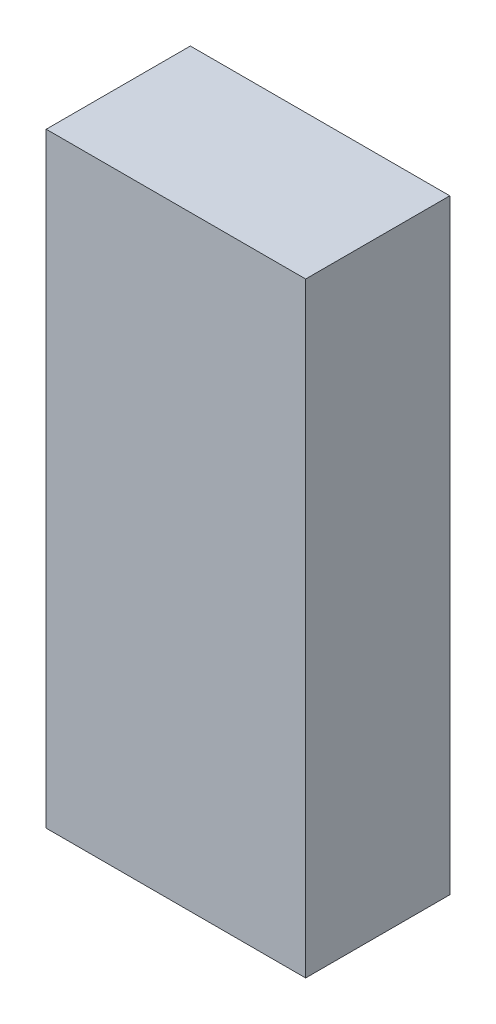
ISO-10303-21;
HEADER;
FILE_DESCRIPTION(('STEP AP214'),'2;1');
FILE_NAME('part.step','',(''),(''),'','','');
FILE_SCHEMA(('AUTOMOTIVE_DESIGN { 1 0 10303 214 1 1 1 1 }'));
ENDSEC;
DATA;
#1=APPLICATION_CONTEXT('core data for automotive mechanical design processes');
#2=APPLICATION_PROTOCOL_DEFINITION('international standard','automotive_design',2000,#1);
#3=PRODUCT_CONTEXT('',#1,'mechanical');
#4=PRODUCT('Part','Part','',(#3));
#5=PRODUCT_RELATED_PRODUCT_CATEGORY('part','',(#4));
#6=PRODUCT_DEFINITION_FORMATION('','',#4);
#7=PRODUCT_DEFINITION_CONTEXT('part definition',#1,'design');
#8=PRODUCT_DEFINITION('design','',#6,#7);
#9=PRODUCT_DEFINITION_SHAPE('','',#8);
#10=(LENGTH_UNIT() NAMED_UNIT(*) SI_UNIT(.MILLI.,.METRE.));
#11=(NAMED_UNIT(*) PLANE_ANGLE_UNIT() SI_UNIT($,.RADIAN.));
#12=(NAMED_UNIT(*) SI_UNIT($,.STERADIAN.) SOLID_ANGLE_UNIT());
#13=UNCERTAINTY_MEASURE_WITH_UNIT(LENGTH_MEASURE(1.E-05),#10,'distance_accuracy_value','');
#14=(GEOMETRIC_REPRESENTATION_CONTEXT(3) GLOBAL_UNCERTAINTY_ASSIGNED_CONTEXT((#13)) GLOBAL_UNIT_ASSIGNED_CONTEXT((#10,
#11,#12)) REPRESENTATION_CONTEXT('',''));
#15=CARTESIAN_POINT('',(0.,0.,0.));
#16=DIRECTION('',(0.,0.,1.));
#17=DIRECTION('',(1.,0.,0.));
#18=AXIS2_PLACEMENT_3D('',#15,#16,#17);
#19=CARTESIAN_POINT('',(0.225,0.525,0.25));
#20=DIRECTION('',(-1.,0.,0.));
#21=DIRECTION('',(0.,0.,1.));
#22=AXIS2_PLACEMENT_3D('',#19,#20,#21);
#23=PLANE('',#22);
#24=DIRECTION('',(0.,1.,0.));
#25=VECTOR('',#24,1.);
#26=CARTESIAN_POINT('',(0.225,0.525,0.));
#27=LINE('',#26,#25);
#28=CARTESIAN_POINT('',(0.225,-0.525,0.));
#29=VERTEX_POINT('',#28);
#30=CARTESIAN_POINT('',(0.225,0.525,0.));
#31=VERTEX_POINT('',#30);
#32=EDGE_CURVE('E99',#29,#31,#27,.T.);
#33=ORIENTED_EDGE('',*,*,#32,.T.);
#34=DIRECTION('',(0.,0.,-1.));
#35=VECTOR('',#34,1.);
#36=CARTESIAN_POINT('',(0.225,0.525,0.25));
#37=LINE('',#36,#35);
#38=CARTESIAN_POINT('',(0.225,0.525,0.25));
#39=VERTEX_POINT('',#38);
#40=EDGE_CURVE('E11',#39,#31,#37,.T.);
#41=ORIENTED_EDGE('',*,*,#40,.F.);
#42=DIRECTION('',(0.,1.,0.));
#43=VECTOR('',#42,1.);
#44=CARTESIAN_POINT('',(0.225,0.525,0.25));
#45=LINE('',#44,#43);
#46=CARTESIAN_POINT('',(0.225,-0.525,0.25));
#47=VERTEX_POINT('',#46);
#48=EDGE_CURVE('E87',#47,#39,#45,.T.);
#49=ORIENTED_EDGE('',*,*,#48,.F.);
#50=DIRECTION('',(0.,0.,-1.));
#51=VECTOR('',#50,1.);
#52=CARTESIAN_POINT('',(0.225,-0.525,0.25));
#53=LINE('',#52,#51);
#54=EDGE_CURVE('E95',#47,#29,#53,.T.);
#55=ORIENTED_EDGE('',*,*,#54,.T.);
#56=EDGE_LOOP('',(#33,#41,#49,#55));
#57=FACE_BOUND('',#56,.T.);
#58=ADVANCED_FACE('F36',(#57),#23,.F.);
#59=CARTESIAN_POINT('',(-0.225,0.525,0.25));
#60=DIRECTION('',(0.,-1.,0.));
#61=DIRECTION('',(0.,0.,-1.));
#62=AXIS2_PLACEMENT_3D('',#59,#60,#61);
#63=PLANE('',#62);
#64=DIRECTION('',(-1.,0.,0.));
#65=VECTOR('',#64,1.);
#66=CARTESIAN_POINT('',(-0.225,0.525,0.));
#67=LINE('',#66,#65);
#68=CARTESIAN_POINT('',(-0.225,0.525,0.));
#69=VERTEX_POINT('',#68);
#70=EDGE_CURVE('E91',#31,#69,#67,.T.);
#71=ORIENTED_EDGE('',*,*,#70,.T.);
#72=DIRECTION('',(0.,0.,-1.));
#73=VECTOR('',#72,1.);
#74=CARTESIAN_POINT('',(-0.225,0.525,0.25));
#75=LINE('',#74,#73);
#76=CARTESIAN_POINT('',(-0.225,0.525,0.25));
#77=VERTEX_POINT('',#76);
#78=EDGE_CURVE('E44',#77,#69,#75,.T.);
#79=ORIENTED_EDGE('',*,*,#78,.F.);
#80=DIRECTION('',(-1.,0.,0.));
#81=VECTOR('',#80,1.);
#82=CARTESIAN_POINT('',(-0.225,0.525,0.25));
#83=LINE('',#82,#81);
#84=EDGE_CURVE('E82',#39,#77,#83,.T.);
#85=ORIENTED_EDGE('',*,*,#84,.F.);
#86=ORIENTED_EDGE('',*,*,#40,.T.);
#87=EDGE_LOOP('',(#71,#79,#85,#86));
#88=FACE_BOUND('',#87,.T.);
#89=ADVANCED_FACE('F90',(#88),#63,.F.);
#90=CARTESIAN_POINT('',(-0.225,0.525,0.25));
#91=DIRECTION('',(1.,0.,0.));
#92=DIRECTION('',(0.,0.,-1.));
#93=AXIS2_PLACEMENT_3D('',#90,#91,#92);
#94=PLANE('',#93);
#95=DIRECTION('',(0.,-1.,0.));
#96=VECTOR('',#95,1.);
#97=CARTESIAN_POINT('',(-0.225,0.525,0.));
#98=LINE('',#97,#96);
#99=CARTESIAN_POINT('',(-0.225,-0.525,0.));
#100=VERTEX_POINT('',#99);
#101=EDGE_CURVE('E69',#69,#100,#98,.T.);
#102=ORIENTED_EDGE('',*,*,#101,.T.);
#103=DIRECTION('',(0.,0.,-1.));
#104=VECTOR('',#103,1.);
#105=CARTESIAN_POINT('',(-0.225,-0.525,0.25));
#106=LINE('',#105,#104);
#107=CARTESIAN_POINT('',(-0.225,-0.525,0.25));
#108=VERTEX_POINT('',#107);
#109=EDGE_CURVE('E92',#108,#100,#106,.T.);
#110=ORIENTED_EDGE('',*,*,#109,.F.);
#111=DIRECTION('',(0.,-1.,0.));
#112=VECTOR('',#111,1.);
#113=CARTESIAN_POINT('',(-0.225,0.525,0.25));
#114=LINE('',#113,#112);
#115=EDGE_CURVE('E85',#77,#108,#114,.T.);
#116=ORIENTED_EDGE('',*,*,#115,.F.);
#117=ORIENTED_EDGE('',*,*,#78,.T.);
#118=EDGE_LOOP('',(#102,#110,#116,#117));
#119=FACE_BOUND('',#118,.T.);
#120=ADVANCED_FACE('F93',(#119),#94,.F.);
#121=CARTESIAN_POINT('',(-0.225,-0.525,0.25));
#122=DIRECTION('',(0.,1.,0.));
#123=DIRECTION('',(0.,0.,1.));
#124=AXIS2_PLACEMENT_3D('',#121,#122,#123);
#125=PLANE('',#124);
#126=DIRECTION('',(1.,0.,0.));
#127=VECTOR('',#126,1.);
#128=CARTESIAN_POINT('',(-0.225,-0.525,0.));
#129=LINE('',#128,#127);
#130=EDGE_CURVE('E75',#100,#29,#129,.T.);
#131=ORIENTED_EDGE('',*,*,#130,.T.);
#132=ORIENTED_EDGE('',*,*,#54,.F.);
#133=DIRECTION('',(1.,0.,0.));
#134=VECTOR('',#133,1.);
#135=CARTESIAN_POINT('',(-0.225,-0.525,0.25));
#136=LINE('',#135,#134);
#137=EDGE_CURVE('E52',#108,#47,#136,.T.);
#138=ORIENTED_EDGE('',*,*,#137,.F.);
#139=ORIENTED_EDGE('',*,*,#109,.T.);
#140=EDGE_LOOP('',(#131,#132,#138,#139));
#141=FACE_BOUND('',#140,.T.);
#142=ADVANCED_FACE('F106',(#141),#125,.F.);
#143=CARTESIAN_POINT('',(0.,0.,0.25));
#144=DIRECTION('',(0.,0.,1.));
#145=DIRECTION('',(1.,0.,0.));
#146=AXIS2_PLACEMENT_3D('',#143,#144,#145);
#147=PLANE('',#146);
#148=ORIENTED_EDGE('',*,*,#48,.T.);
#149=ORIENTED_EDGE('',*,*,#84,.T.);
#150=ORIENTED_EDGE('',*,*,#115,.T.);
#151=ORIENTED_EDGE('',*,*,#137,.T.);
#152=EDGE_LOOP('',(#148,#149,#150,#151));
#153=FACE_BOUND('',#152,.T.);
#154=ADVANCED_FACE('F83',(#153),#147,.T.);
#155=CARTESIAN_POINT('',(0.,0.,0.));
#156=DIRECTION('',(0.,0.,1.));
#157=DIRECTION('',(1.,0.,0.));
#158=AXIS2_PLACEMENT_3D('',#155,#156,#157);
#159=PLANE('',#158);
#160=ORIENTED_EDGE('',*,*,#32,.F.);
#161=ORIENTED_EDGE('',*,*,#130,.F.);
#162=ORIENTED_EDGE('',*,*,#101,.F.);
#163=ORIENTED_EDGE('',*,*,#70,.F.);
#164=EDGE_LOOP('',(#160,#161,#162,#163));
#165=FACE_BOUND('',#164,.T.);
#166=ADVANCED_FACE('F109',(#165),#159,.F.);
#167=CLOSED_SHELL('',(#58,#89,#120,#142,#154,#166));
#168=MANIFOLD_SOLID_BREP('B2',#167);
#169=ADVANCED_BREP_SHAPE_REPRESENTATION('',(#18,#168),#14);
#170=SHAPE_DEFINITION_REPRESENTATION(#9,#169);
ENDSEC;
END-ISO-10303-21;
